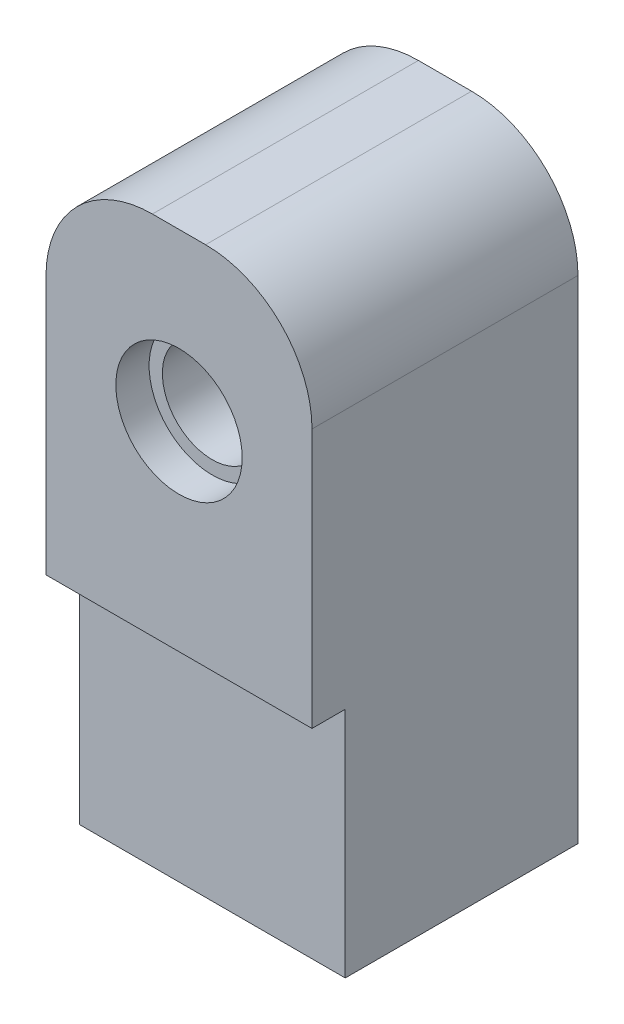
ISO-10303-21;
HEADER;
FILE_DESCRIPTION(('STEP AP214'),'2;1');
FILE_NAME('part.step','',(''),(''),'','','');
FILE_SCHEMA(('AUTOMOTIVE_DESIGN { 1 0 10303 214 1 1 1 1 }'));
ENDSEC;
DATA;
#1=APPLICATION_CONTEXT('core data for automotive mechanical design processes');
#2=APPLICATION_PROTOCOL_DEFINITION('international standard','automotive_design',2000,#1);
#3=PRODUCT_CONTEXT('',#1,'mechanical');
#4=PRODUCT('Part','Part','',(#3));
#5=PRODUCT_RELATED_PRODUCT_CATEGORY('part','',(#4));
#6=PRODUCT_DEFINITION_FORMATION('','',#4);
#7=PRODUCT_DEFINITION_CONTEXT('part definition',#1,'design');
#8=PRODUCT_DEFINITION('design','',#6,#7);
#9=PRODUCT_DEFINITION_SHAPE('','',#8);
#10=(LENGTH_UNIT() NAMED_UNIT(*) SI_UNIT(.MILLI.,.METRE.));
#11=(NAMED_UNIT(*) PLANE_ANGLE_UNIT() SI_UNIT($,.RADIAN.));
#12=(NAMED_UNIT(*) SI_UNIT($,.STERADIAN.) SOLID_ANGLE_UNIT());
#13=UNCERTAINTY_MEASURE_WITH_UNIT(LENGTH_MEASURE(1.E-05),#10,'distance_accuracy_value','');
#14=(GEOMETRIC_REPRESENTATION_CONTEXT(3) GLOBAL_UNCERTAINTY_ASSIGNED_CONTEXT((#13)) GLOBAL_UNIT_ASSIGNED_CONTEXT((#10,
#11,#12)) REPRESENTATION_CONTEXT('',''));
#15=CARTESIAN_POINT('',(0.,0.,0.));
#16=DIRECTION('',(0.,0.,1.));
#17=DIRECTION('',(1.,0.,0.));
#18=AXIS2_PLACEMENT_3D('',#15,#16,#17);
#19=CARTESIAN_POINT('',(0.5,2.25,-0.5));
#20=DIRECTION('',(-1.,0.,0.));
#21=DIRECTION('',(0.,0.,1.));
#22=AXIS2_PLACEMENT_3D('',#19,#20,#21);
#23=PLANE('',#22);
#24=DIRECTION('',(0.,-1.,0.));
#25=VECTOR('',#24,1.);
#26=CARTESIAN_POINT('',(0.5,2.25,-0.5));
#27=LINE('',#26,#25);
#28=CARTESIAN_POINT('',(0.5,1.85,-0.5));
#29=VERTEX_POINT('',#28);
#30=CARTESIAN_POINT('',(0.5,0.,-0.5));
#31=VERTEX_POINT('',#30);
#32=EDGE_CURVE('E139',#29,#31,#27,.T.);
#33=ORIENTED_EDGE('',*,*,#32,.F.);
#34=DIRECTION('',(0.,0.,-1.));
#35=VECTOR('',#34,1.);
#36=CARTESIAN_POINT('',(0.5,1.85,0.5));
#37=LINE('',#36,#35);
#38=CARTESIAN_POINT('',(0.5,1.85,0.5));
#39=VERTEX_POINT('',#38);
#40=EDGE_CURVE('E146',#29,#39,#37,.F.);
#41=ORIENTED_EDGE('',*,*,#40,.T.);
#42=DIRECTION('',(0.,-1.,0.));
#43=VECTOR('',#42,1.);
#44=CARTESIAN_POINT('',(0.5,2.25,0.5));
#45=LINE('',#44,#43);
#46=CARTESIAN_POINT('',(0.5,0.875,0.5));
#47=VERTEX_POINT('',#46);
#48=EDGE_CURVE('E133',#39,#47,#45,.T.);
#49=ORIENTED_EDGE('',*,*,#48,.T.);
#50=DIRECTION('',(0.,0.,-1.));
#51=VECTOR('',#50,1.);
#52=CARTESIAN_POINT('',(0.5,0.875,0.5));
#53=LINE('',#52,#51);
#54=CARTESIAN_POINT('',(0.5,0.875,0.375));
#55=VERTEX_POINT('',#54);
#56=EDGE_CURVE('E118',#47,#55,#53,.T.);
#57=ORIENTED_EDGE('',*,*,#56,.T.);
#58=DIRECTION('',(0.,1.,0.));
#59=VECTOR('',#58,1.);
#60=CARTESIAN_POINT('',(0.5,0.,0.375));
#61=LINE('',#60,#59);
#62=CARTESIAN_POINT('',(0.5,0.,0.375));
#63=VERTEX_POINT('',#62);
#64=EDGE_CURVE('E101',#63,#55,#61,.T.);
#65=ORIENTED_EDGE('',*,*,#64,.F.);
#66=DIRECTION('',(0.,0.,-1.));
#67=VECTOR('',#66,1.);
#68=CARTESIAN_POINT('',(0.5,0.,-0.5));
#69=LINE('',#68,#67);
#70=EDGE_CURVE('E115',#63,#31,#69,.T.);
#71=ORIENTED_EDGE('',*,*,#70,.T.);
#72=EDGE_LOOP('',(#33,#41,#49,#57,#65,#71));
#73=FACE_BOUND('',#72,.T.);
#74=ADVANCED_FACE('F36',(#73),#23,.F.);
#75=CARTESIAN_POINT('',(-0.5,2.25,-0.5));
#76=DIRECTION('',(0.,0.,1.));
#77=DIRECTION('',(1.,0.,0.));
#78=AXIS2_PLACEMENT_3D('',#75,#76,#77);
#79=PLANE('',#78);
#80=CARTESIAN_POINT('',(0.,1.625,-0.5));
#81=DIRECTION('',(0.,0.,1.));
#82=DIRECTION('',(1.,0.,0.));
#83=AXIS2_PLACEMENT_3D('',#80,#81,#82);
#84=CIRCLE('',#83,0.1875);
#85=CARTESIAN_POINT('',(0.1875,1.625,-0.5));
#86=VERTEX_POINT('',#85);
#87=EDGE_CURVE('E178',#86,#86,#84,.T.);
#88=ORIENTED_EDGE('',*,*,#87,.T.);
#89=EDGE_LOOP('',(#88));
#90=FACE_BOUND('',#89,.T.);
#91=DIRECTION('',(0.,-1.,0.));
#92=VECTOR('',#91,1.);
#93=CARTESIAN_POINT('',(-0.5,2.25,-0.5));
#94=LINE('',#93,#92);
#95=CARTESIAN_POINT('',(-0.5,1.85,-0.5));
#96=VERTEX_POINT('',#95);
#97=CARTESIAN_POINT('',(-0.5,0.,-0.5));
#98=VERTEX_POINT('',#97);
#99=EDGE_CURVE('E137',#96,#98,#94,.T.);
#100=ORIENTED_EDGE('',*,*,#99,.F.);
#101=CARTESIAN_POINT('',(-0.1,1.85,-0.5));
#102=DIRECTION('',(0.,0.,1.));
#103=DIRECTION('',(1.,0.,0.));
#104=AXIS2_PLACEMENT_3D('',#101,#102,#103);
#105=CIRCLE('',#104,0.4);
#106=CARTESIAN_POINT('',(-0.1,2.25,-0.5));
#107=VERTEX_POINT('',#106);
#108=EDGE_CURVE('E11',#96,#107,#105,.F.);
#109=ORIENTED_EDGE('',*,*,#108,.T.);
#110=DIRECTION('',(-1.,0.,0.));
#111=VECTOR('',#110,1.);
#112=CARTESIAN_POINT('',(-0.5,2.25,-0.5));
#113=LINE('',#112,#111);
#114=CARTESIAN_POINT('',(0.0999999999999999,2.25,-0.5));
#115=VERTEX_POINT('',#114);
#116=EDGE_CURVE('E132',#115,#107,#113,.T.);
#117=ORIENTED_EDGE('',*,*,#116,.F.);
#118=CARTESIAN_POINT('',(0.0999999999999999,1.85,-0.5));
#119=DIRECTION('',(0.,0.,1.));
#120=DIRECTION('',(1.,0.,0.));
#121=AXIS2_PLACEMENT_3D('',#118,#119,#120);
#122=CIRCLE('',#121,0.4);
#123=EDGE_CURVE('E144',#115,#29,#122,.F.);
#124=ORIENTED_EDGE('',*,*,#123,.T.);
#125=ORIENTED_EDGE('',*,*,#32,.T.);
#126=DIRECTION('',(-1.,0.,0.));
#127=VECTOR('',#126,1.);
#128=CARTESIAN_POINT('',(-0.5,0.,-0.5));
#129=LINE('',#128,#127);
#130=EDGE_CURVE('E122',#31,#98,#129,.T.);
#131=ORIENTED_EDGE('',*,*,#130,.T.);
#132=EDGE_LOOP('',(#100,#109,#117,#124,#125,#131));
#133=FACE_BOUND('',#132,.T.);
#134=ADVANCED_FACE('F208',(#90,#133),#79,.F.);
#135=CARTESIAN_POINT('',(-0.5,2.25,-0.5));
#136=DIRECTION('',(1.,0.,0.));
#137=DIRECTION('',(0.,0.,-1.));
#138=AXIS2_PLACEMENT_3D('',#135,#136,#137);
#139=PLANE('',#138);
#140=DIRECTION('',(0.,-1.,0.));
#141=VECTOR('',#140,1.);
#142=CARTESIAN_POINT('',(-0.5,2.25,0.5));
#143=LINE('',#142,#141);
#144=CARTESIAN_POINT('',(-0.5,1.85,0.5));
#145=VERTEX_POINT('',#144);
#146=CARTESIAN_POINT('',(-0.5,0.875,0.5));
#147=VERTEX_POINT('',#146);
#148=EDGE_CURVE('E135',#145,#147,#143,.T.);
#149=ORIENTED_EDGE('',*,*,#148,.F.);
#150=DIRECTION('',(0.,0.,1.));
#151=VECTOR('',#150,1.);
#152=CARTESIAN_POINT('',(-0.5,1.85,-0.5));
#153=LINE('',#152,#151);
#154=EDGE_CURVE('E44',#145,#96,#153,.F.);
#155=ORIENTED_EDGE('',*,*,#154,.T.);
#156=ORIENTED_EDGE('',*,*,#99,.T.);
#157=DIRECTION('',(0.,0.,1.));
#158=VECTOR('',#157,1.);
#159=CARTESIAN_POINT('',(-0.5,0.,-0.5));
#160=LINE('',#159,#158);
#161=CARTESIAN_POINT('',(-0.5,0.,0.375));
#162=VERTEX_POINT('',#161);
#163=EDGE_CURVE('E124',#98,#162,#160,.T.);
#164=ORIENTED_EDGE('',*,*,#163,.T.);
#165=DIRECTION('',(0.,1.,0.));
#166=VECTOR('',#165,1.);
#167=CARTESIAN_POINT('',(-0.5,0.,0.375));
#168=LINE('',#167,#166);
#169=CARTESIAN_POINT('',(-0.5,0.875,0.375));
#170=VERTEX_POINT('',#169);
#171=EDGE_CURVE('E104',#162,#170,#168,.T.);
#172=ORIENTED_EDGE('',*,*,#171,.T.);
#173=DIRECTION('',(0.,0.,1.));
#174=VECTOR('',#173,1.);
#175=CARTESIAN_POINT('',(-0.5,0.875,0.5));
#176=LINE('',#175,#174);
#177=EDGE_CURVE('E109',#170,#147,#176,.T.);
#178=ORIENTED_EDGE('',*,*,#177,.T.);
#179=EDGE_LOOP('',(#149,#155,#156,#164,#172,#178));
#180=FACE_BOUND('',#179,.T.);
#181=ADVANCED_FACE('F213',(#180),#139,.F.);
#182=CARTESIAN_POINT('',(-0.5,2.25,0.5));
#183=DIRECTION('',(0.,0.,-1.));
#184=DIRECTION('',(-1.,0.,0.));
#185=AXIS2_PLACEMENT_3D('',#182,#183,#184);
#186=PLANE('',#185);
#187=CARTESIAN_POINT('',(0.,1.625,0.5));
#188=DIRECTION('',(0.,0.,1.));
#189=DIRECTION('',(1.,0.,0.));
#190=AXIS2_PLACEMENT_3D('',#187,#188,#189);
#191=CIRCLE('',#190,0.2375);
#192=CARTESIAN_POINT('',(0.2375,1.625,0.5));
#193=VERTEX_POINT('',#192);
#194=EDGE_CURVE('E175',#193,#193,#191,.T.);
#195=ORIENTED_EDGE('',*,*,#194,.F.);
#196=EDGE_LOOP('',(#195));
#197=FACE_BOUND('',#196,.T.);
#198=DIRECTION('',(1.,0.,0.));
#199=VECTOR('',#198,1.);
#200=CARTESIAN_POINT('',(-0.5,2.25,0.5));
#201=LINE('',#200,#199);
#202=CARTESIAN_POINT('',(-0.0999999999999999,2.25,0.5));
#203=VERTEX_POINT('',#202);
#204=CARTESIAN_POINT('',(0.1,2.25,0.5));
#205=VERTEX_POINT('',#204);
#206=EDGE_CURVE('E128',#203,#205,#201,.T.);
#207=ORIENTED_EDGE('',*,*,#206,.F.);
#208=CARTESIAN_POINT('',(-0.0999999999999999,1.85,0.5));
#209=DIRECTION('',(0.,0.,-1.));
#210=DIRECTION('',(-1.,0.,0.));
#211=AXIS2_PLACEMENT_3D('',#208,#209,#210);
#212=CIRCLE('',#211,0.4);
#213=EDGE_CURVE('E58',#203,#145,#212,.F.);
#214=ORIENTED_EDGE('',*,*,#213,.T.);
#215=ORIENTED_EDGE('',*,*,#148,.T.);
#216=DIRECTION('',(1.,0.,0.));
#217=VECTOR('',#216,1.);
#218=CARTESIAN_POINT('',(-0.5,0.875,0.5));
#219=LINE('',#218,#217);
#220=EDGE_CURVE('E171',#147,#47,#219,.T.);
#221=ORIENTED_EDGE('',*,*,#220,.T.);
#222=ORIENTED_EDGE('',*,*,#48,.F.);
#223=CARTESIAN_POINT('',(0.1,1.85,0.5));
#224=DIRECTION('',(0.,0.,-1.));
#225=DIRECTION('',(-1.,0.,0.));
#226=AXIS2_PLACEMENT_3D('',#223,#224,#225);
#227=CIRCLE('',#226,0.4);
#228=EDGE_CURVE('E148',#39,#205,#227,.F.);
#229=ORIENTED_EDGE('',*,*,#228,.T.);
#230=EDGE_LOOP('',(#207,#214,#215,#221,#222,#229));
#231=FACE_BOUND('',#230,.T.);
#232=ADVANCED_FACE('F161',(#197,#231),#186,.F.);
#233=CARTESIAN_POINT('',(0.,2.25,0.));
#234=DIRECTION('',(0.,1.,0.));
#235=DIRECTION('',(0.,0.,1.));
#236=AXIS2_PLACEMENT_3D('',#233,#234,#235);
#237=PLANE('',#236);
#238=ORIENTED_EDGE('',*,*,#116,.T.);
#239=DIRECTION('',(0.,0.,1.));
#240=VECTOR('',#239,1.);
#241=CARTESIAN_POINT('',(-0.0999999999999999,2.25,0.5));
#242=LINE('',#241,#240);
#243=EDGE_CURVE('E151',#107,#203,#242,.T.);
#244=ORIENTED_EDGE('',*,*,#243,.T.);
#245=ORIENTED_EDGE('',*,*,#206,.T.);
#246=DIRECTION('',(0.,0.,-1.));
#247=VECTOR('',#246,1.);
#248=CARTESIAN_POINT('',(0.0999999999999999,2.25,-0.5));
#249=LINE('',#248,#247);
#250=EDGE_CURVE('E141',#205,#115,#249,.T.);
#251=ORIENTED_EDGE('',*,*,#250,.T.);
#252=EDGE_LOOP('',(#238,#244,#245,#251));
#253=FACE_BOUND('',#252,.T.);
#254=ADVANCED_FACE('F157',(#253),#237,.T.);
#255=CARTESIAN_POINT('',(0.,0.,0.));
#256=DIRECTION('',(0.,1.,0.));
#257=DIRECTION('',(0.,0.,1.));
#258=AXIS2_PLACEMENT_3D('',#255,#256,#257);
#259=PLANE('',#258);
#260=CARTESIAN_POINT('',(0.,0.,0.));
#261=DIRECTION('',(0.,1.,0.));
#262=DIRECTION('',(0.,0.,1.));
#263=AXIS2_PLACEMENT_3D('',#260,#261,#262);
#264=CIRCLE('',#263,0.25);
#265=CARTESIAN_POINT('',(0.,0.,0.25));
#266=VERTEX_POINT('',#265);
#267=EDGE_CURVE('E187',#266,#266,#264,.T.);
#268=ORIENTED_EDGE('',*,*,#267,.T.);
#269=EDGE_LOOP('',(#268));
#270=FACE_BOUND('',#269,.T.);
#271=ORIENTED_EDGE('',*,*,#70,.F.);
#272=DIRECTION('',(-1.,0.,0.));
#273=VECTOR('',#272,1.);
#274=CARTESIAN_POINT('',(-0.5,0.,0.375));
#275=LINE('',#274,#273);
#276=EDGE_CURVE('E98',#63,#162,#275,.T.);
#277=ORIENTED_EDGE('',*,*,#276,.T.);
#278=ORIENTED_EDGE('',*,*,#163,.F.);
#279=ORIENTED_EDGE('',*,*,#130,.F.);
#280=EDGE_LOOP('',(#271,#277,#278,#279));
#281=FACE_BOUND('',#280,.T.);
#282=ADVANCED_FACE('F120',(#270,#281),#259,.F.);
#283=CARTESIAN_POINT('',(-0.5,0.,0.375));
#284=DIRECTION('',(0.,0.,-1.));
#285=DIRECTION('',(-1.,0.,0.));
#286=AXIS2_PLACEMENT_3D('',#283,#284,#285);
#287=PLANE('',#286);
#288=DIRECTION('',(-1.,0.,0.));
#289=VECTOR('',#288,1.);
#290=CARTESIAN_POINT('',(-0.5,0.875,0.375));
#291=LINE('',#290,#289);
#292=EDGE_CURVE('E168',#55,#170,#291,.T.);
#293=ORIENTED_EDGE('',*,*,#292,.T.);
#294=ORIENTED_EDGE('',*,*,#171,.F.);
#295=ORIENTED_EDGE('',*,*,#276,.F.);
#296=ORIENTED_EDGE('',*,*,#64,.T.);
#297=EDGE_LOOP('',(#293,#294,#295,#296));
#298=FACE_BOUND('',#297,.T.);
#299=ADVANCED_FACE('F100',(#298),#287,.F.);
#300=CARTESIAN_POINT('',(0.,0.875,0.));
#301=DIRECTION('',(0.,1.,0.));
#302=DIRECTION('',(0.,0.,1.));
#303=AXIS2_PLACEMENT_3D('',#300,#301,#302);
#304=PLANE('',#303);
#305=ORIENTED_EDGE('',*,*,#220,.F.);
#306=ORIENTED_EDGE('',*,*,#177,.F.);
#307=ORIENTED_EDGE('',*,*,#292,.F.);
#308=ORIENTED_EDGE('',*,*,#56,.F.);
#309=EDGE_LOOP('',(#305,#306,#307,#308));
#310=FACE_BOUND('',#309,.T.);
#311=ADVANCED_FACE('F229',(#310),#304,.F.);
#312=CARTESIAN_POINT('',(0.,1.625,0.375));
#313=DIRECTION('',(0.,0.,1.));
#314=DIRECTION('',(1.,0.,0.));
#315=AXIS2_PLACEMENT_3D('',#312,#313,#314);
#316=CYLINDRICAL_SURFACE('',#315,0.2375);
#317=CARTESIAN_POINT('',(0.,1.625,0.375));
#318=DIRECTION('',(0.,0.,1.));
#319=DIRECTION('',(1.,0.,0.));
#320=AXIS2_PLACEMENT_3D('',#317,#318,#319);
#321=CIRCLE('',#320,0.2375);
#322=CARTESIAN_POINT('',(0.2375,1.625,0.375));
#323=VERTEX_POINT('',#322);
#324=EDGE_CURVE('E173',#323,#323,#321,.T.);
#325=ORIENTED_EDGE('',*,*,#324,.F.);
#326=EDGE_LOOP('',(#325));
#327=FACE_BOUND('',#326,.T.);
#328=ORIENTED_EDGE('',*,*,#194,.T.);
#329=EDGE_LOOP('',(#328));
#330=FACE_BOUND('',#329,.T.);
#331=ADVANCED_FACE('F232',(#327,#330),#316,.F.);
#332=CARTESIAN_POINT('',(0.,1.625,0.375));
#333=DIRECTION('',(0.,0.,1.));
#334=DIRECTION('',(1.,0.,0.));
#335=AXIS2_PLACEMENT_3D('',#332,#333,#334);
#336=PLANE('',#335);
#337=CARTESIAN_POINT('',(0.,1.625,0.375));
#338=DIRECTION('',(0.,0.,1.));
#339=DIRECTION('',(1.,0.,0.));
#340=AXIS2_PLACEMENT_3D('',#337,#338,#339);
#341=CIRCLE('',#340,0.1875);
#342=CARTESIAN_POINT('',(0.1875,1.625,0.375));
#343=VERTEX_POINT('',#342);
#344=EDGE_CURVE('E181',#343,#343,#341,.T.);
#345=ORIENTED_EDGE('',*,*,#344,.F.);
#346=EDGE_LOOP('',(#345));
#347=FACE_BOUND('',#346,.T.);
#348=ORIENTED_EDGE('',*,*,#324,.T.);
#349=EDGE_LOOP('',(#348));
#350=FACE_BOUND('',#349,.T.);
#351=ADVANCED_FACE('F236',(#347,#350),#336,.T.);
#352=CARTESIAN_POINT('',(0.,1.625,-0.5));
#353=DIRECTION('',(0.,0.,1.));
#354=DIRECTION('',(1.,0.,0.));
#355=AXIS2_PLACEMENT_3D('',#352,#353,#354);
#356=CYLINDRICAL_SURFACE('',#355,0.1875);
#357=ORIENTED_EDGE('',*,*,#87,.F.);
#358=EDGE_LOOP('',(#357));
#359=FACE_BOUND('',#358,.T.);
#360=ORIENTED_EDGE('',*,*,#344,.T.);
#361=EDGE_LOOP('',(#360));
#362=FACE_BOUND('',#361,.T.);
#363=ADVANCED_FACE('F205',(#359,#362),#356,.F.);
#364=CARTESIAN_POINT('',(0.,1.188,0.));
#365=DIRECTION('',(0.,-1.,0.));
#366=DIRECTION('',(0.,0.,-1.));
#367=AXIS2_PLACEMENT_3D('',#364,#365,#366);
#368=CYLINDRICAL_SURFACE('',#367,0.25);
#369=CARTESIAN_POINT('',(0.,1.188,0.));
#370=DIRECTION('',(0.,1.,0.));
#371=DIRECTION('',(0.,0.,1.));
#372=AXIS2_PLACEMENT_3D('',#369,#370,#371);
#373=CIRCLE('',#372,0.25);
#374=CARTESIAN_POINT('',(0.,1.188,0.25));
#375=VERTEX_POINT('',#374);
#376=EDGE_CURVE('E184',#375,#375,#373,.T.);
#377=ORIENTED_EDGE('',*,*,#376,.T.);
#378=EDGE_LOOP('',(#377));
#379=FACE_BOUND('',#378,.T.);
#380=ORIENTED_EDGE('',*,*,#267,.F.);
#381=EDGE_LOOP('',(#380));
#382=FACE_BOUND('',#381,.T.);
#383=ADVANCED_FACE('F193',(#379,#382),#368,.F.);
#384=CARTESIAN_POINT('',(0.,1.188,0.));
#385=DIRECTION('',(0.,1.,0.));
#386=DIRECTION('',(0.,0.,1.));
#387=AXIS2_PLACEMENT_3D('',#384,#385,#386);
#388=PLANE('',#387);
#389=ORIENTED_EDGE('',*,*,#376,.F.);
#390=EDGE_LOOP('',(#389));
#391=FACE_BOUND('',#390,.T.);
#392=ADVANCED_FACE('F196',(#391),#388,.F.);
#393=CARTESIAN_POINT('',(0.1,1.85,0.));
#394=DIRECTION('',(0.,0.,1.));
#395=DIRECTION('',(1.,0.,0.));
#396=AXIS2_PLACEMENT_3D('',#393,#394,#395);
#397=CYLINDRICAL_SURFACE('',#396,0.4);
#398=ORIENTED_EDGE('',*,*,#228,.F.);
#399=ORIENTED_EDGE('',*,*,#40,.F.);
#400=ORIENTED_EDGE('',*,*,#123,.F.);
#401=ORIENTED_EDGE('',*,*,#250,.F.);
#402=EDGE_LOOP('',(#398,#399,#400,#401));
#403=FACE_BOUND('',#402,.T.);
#404=ADVANCED_FACE('F198',(#403),#397,.T.);
#405=CARTESIAN_POINT('',(-0.1,1.85,0.));
#406=DIRECTION('',(0.,0.,-1.));
#407=DIRECTION('',(-1.,0.,0.));
#408=AXIS2_PLACEMENT_3D('',#405,#406,#407);
#409=CYLINDRICAL_SURFACE('',#408,0.4);
#410=ORIENTED_EDGE('',*,*,#108,.F.);
#411=ORIENTED_EDGE('',*,*,#154,.F.);
#412=ORIENTED_EDGE('',*,*,#213,.F.);
#413=ORIENTED_EDGE('',*,*,#243,.F.);
#414=EDGE_LOOP('',(#410,#411,#412,#413));
#415=FACE_BOUND('',#414,.T.);
#416=ADVANCED_FACE('F38',(#415),#409,.T.);
#417=CLOSED_SHELL('',(#74,#134,#181,#232,#254,#282,#299,#311,#331,#351,#363,#383,#392,#404,#416));
#418=MANIFOLD_SOLID_BREP('B2',#417);
#419=ADVANCED_BREP_SHAPE_REPRESENTATION('',(#18,#418),#14);
#420=SHAPE_DEFINITION_REPRESENTATION(#9,#419);
ENDSEC;
END-ISO-10303-21;
